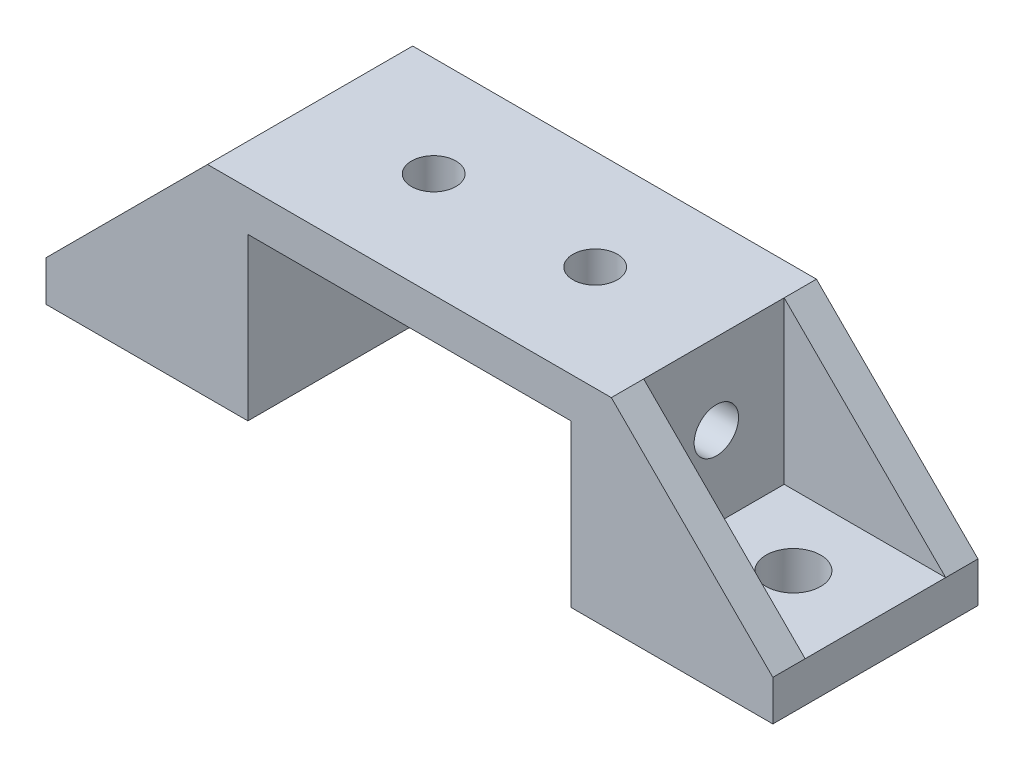
ISO-10303-21;
HEADER;
FILE_DESCRIPTION(('STEP AP214'),'2;1');
FILE_NAME('part.step','',(''),(''),'','','');
FILE_SCHEMA(('AUTOMOTIVE_DESIGN { 1 0 10303 214 1 1 1 1 }'));
ENDSEC;
DATA;
#1=APPLICATION_CONTEXT('core data for automotive mechanical design processes');
#2=APPLICATION_PROTOCOL_DEFINITION('international standard','automotive_design',2000,#1);
#3=PRODUCT_CONTEXT('',#1,'mechanical');
#4=PRODUCT('Part','Part','',(#3));
#5=PRODUCT_RELATED_PRODUCT_CATEGORY('part','',(#4));
#6=PRODUCT_DEFINITION_FORMATION('','',#4);
#7=PRODUCT_DEFINITION_CONTEXT('part definition',#1,'design');
#8=PRODUCT_DEFINITION('design','',#6,#7);
#9=PRODUCT_DEFINITION_SHAPE('','',#8);
#10=(LENGTH_UNIT() NAMED_UNIT(*) SI_UNIT(.MILLI.,.METRE.));
#11=(NAMED_UNIT(*) PLANE_ANGLE_UNIT() SI_UNIT($,.RADIAN.));
#12=(NAMED_UNIT(*) SI_UNIT($,.STERADIAN.) SOLID_ANGLE_UNIT());
#13=UNCERTAINTY_MEASURE_WITH_UNIT(LENGTH_MEASURE(1.E-05),#10,'distance_accuracy_value','');
#14=(GEOMETRIC_REPRESENTATION_CONTEXT(3) GLOBAL_UNCERTAINTY_ASSIGNED_CONTEXT((#13)) GLOBAL_UNIT_ASSIGNED_CONTEXT((#10,
#11,#12)) REPRESENTATION_CONTEXT('',''));
#15=CARTESIAN_POINT('',(0.,0.,0.));
#16=DIRECTION('',(0.,0.,1.));
#17=DIRECTION('',(1.,0.,0.));
#18=AXIS2_PLACEMENT_3D('',#15,#16,#17);
#19=CARTESIAN_POINT('',(0.,15.,25.4));
#20=DIRECTION('',(0.,1.,0.));
#21=DIRECTION('',(0.,0.,1.));
#22=AXIS2_PLACEMENT_3D('',#19,#20,#21);
#23=PLANE('',#22);
#24=CARTESIAN_POINT('',(10.,15.,12.4));
#25=DIRECTION('',(0.,1.,0.));
#26=DIRECTION('',(0.,0.,1.));
#27=AXIS2_PLACEMENT_3D('',#24,#25,#26);
#28=CIRCLE('',#27,2.74999999999999);
#29=CARTESIAN_POINT('',(10.,15.,15.15));
#30=VERTEX_POINT('',#29);
#31=EDGE_CURVE('E337',#30,#30,#28,.T.);
#32=ORIENTED_EDGE('',*,*,#31,.F.);
#33=EDGE_LOOP('',(#32));
#34=FACE_BOUND('',#33,.T.);
#35=CARTESIAN_POINT('',(-10.,15.,12.4));
#36=DIRECTION('',(0.,1.,0.));
#37=DIRECTION('',(0.,0.,1.));
#38=AXIS2_PLACEMENT_3D('',#35,#36,#37);
#39=CIRCLE('',#38,2.74999999999999);
#40=CARTESIAN_POINT('',(-10.,15.,15.15));
#41=VERTEX_POINT('',#40);
#42=EDGE_CURVE('E210',#41,#41,#39,.T.);
#43=ORIENTED_EDGE('',*,*,#42,.F.);
#44=EDGE_LOOP('',(#43));
#45=FACE_BOUND('',#44,.T.);
#46=DIRECTION('',(1.,0.,0.));
#47=VECTOR('',#46,1.);
#48=CARTESIAN_POINT('',(0.,15.,0.));
#49=LINE('',#48,#47);
#50=CARTESIAN_POINT('',(-25.,15.,0.));
#51=VERTEX_POINT('',#50);
#52=CARTESIAN_POINT('',(25.,15.,0.));
#53=VERTEX_POINT('',#52);
#54=EDGE_CURVE('E252',#51,#53,#49,.T.);
#55=ORIENTED_EDGE('',*,*,#54,.F.);
#56=DIRECTION('',(0.,0.,-1.));
#57=VECTOR('',#56,1.);
#58=CARTESIAN_POINT('',(-25.,15.,4.));
#59=LINE('',#58,#57);
#60=CARTESIAN_POINT('',(-25.,15.,4.));
#61=VERTEX_POINT('',#60);
#62=EDGE_CURVE('E242',#61,#51,#59,.T.);
#63=ORIENTED_EDGE('',*,*,#62,.F.);
#64=DIRECTION('',(0.,0.,-1.));
#65=VECTOR('',#64,1.);
#66=CARTESIAN_POINT('',(-25.,15.,25.4));
#67=LINE('',#66,#65);
#68=CARTESIAN_POINT('',(-25.,15.,21.4));
#69=VERTEX_POINT('',#68);
#70=EDGE_CURVE('E48',#69,#61,#67,.T.);
#71=ORIENTED_EDGE('',*,*,#70,.F.);
#72=CARTESIAN_POINT('',(-25.,15.,25.4));
#73=VERTEX_POINT('',#72);
#74=EDGE_CURVE('E11',#73,#69,#67,.T.);
#75=ORIENTED_EDGE('',*,*,#74,.F.);
#76=DIRECTION('',(1.,0.,0.));
#77=VECTOR('',#76,1.);
#78=CARTESIAN_POINT('',(0.,15.,25.4));
#79=LINE('',#78,#77);
#80=CARTESIAN_POINT('',(25.,15.,25.4));
#81=VERTEX_POINT('',#80);
#82=EDGE_CURVE('E253',#73,#81,#79,.T.);
#83=ORIENTED_EDGE('',*,*,#82,.T.);
#84=DIRECTION('',(0.,0.,-1.));
#85=VECTOR('',#84,1.);
#86=CARTESIAN_POINT('',(25.,15.,25.4));
#87=LINE('',#86,#85);
#88=CARTESIAN_POINT('',(25.,15.,21.4));
#89=VERTEX_POINT('',#88);
#90=EDGE_CURVE('E185',#81,#89,#87,.T.);
#91=ORIENTED_EDGE('',*,*,#90,.T.);
#92=CARTESIAN_POINT('',(25.,15.,4.));
#93=VERTEX_POINT('',#92);
#94=EDGE_CURVE('E383',#89,#93,#87,.T.);
#95=ORIENTED_EDGE('',*,*,#94,.T.);
#96=DIRECTION('',(0.,0.,-1.));
#97=VECTOR('',#96,1.);
#98=CARTESIAN_POINT('',(25.,15.,4.));
#99=LINE('',#98,#97);
#100=EDGE_CURVE('E345',#93,#53,#99,.T.);
#101=ORIENTED_EDGE('',*,*,#100,.T.);
#102=EDGE_LOOP('',(#55,#63,#71,#75,#83,#91,#95,#101));
#103=FACE_BOUND('',#102,.T.);
#104=ADVANCED_FACE('F39',(#34,#45,#103),#23,.T.);
#105=CARTESIAN_POINT('',(-25.,0.,25.4));
#106=DIRECTION('',(-1.,0.,0.));
#107=DIRECTION('',(0.,-1.,0.));
#108=AXIS2_PLACEMENT_3D('',#105,#106,#107);
#109=PLANE('',#108);
#110=CARTESIAN_POINT('',(-25.,5.,12.4));
#111=DIRECTION('',(-1.,0.,0.));
#112=DIRECTION('',(0.,0.,1.));
#113=AXIS2_PLACEMENT_3D('',#110,#111,#112);
#114=CIRCLE('',#113,2.74999999999999);
#115=CARTESIAN_POINT('',(-25.,5.,15.15));
#116=VERTEX_POINT('',#115);
#117=EDGE_CURVE('E202',#116,#116,#114,.T.);
#118=ORIENTED_EDGE('',*,*,#117,.F.);
#119=EDGE_LOOP('',(#118));
#120=FACE_BOUND('',#119,.T.);
#121=DIRECTION('',(0.,1.,0.));
#122=VECTOR('',#121,1.);
#123=CARTESIAN_POINT('',(-25.,0.,21.4));
#124=LINE('',#123,#122);
#125=CARTESIAN_POINT('',(-25.,-5.00000000000001,21.4));
#126=VERTEX_POINT('',#125);
#127=EDGE_CURVE('E219',#126,#69,#124,.T.);
#128=ORIENTED_EDGE('',*,*,#127,.T.);
#129=ORIENTED_EDGE('',*,*,#70,.T.);
#130=DIRECTION('',(0.,1.,0.));
#131=VECTOR('',#130,1.);
#132=CARTESIAN_POINT('',(-25.,0.,4.));
#133=LINE('',#132,#131);
#134=CARTESIAN_POINT('',(-25.,-5.00000000000001,4.));
#135=VERTEX_POINT('',#134);
#136=EDGE_CURVE('E238',#135,#61,#133,.T.);
#137=ORIENTED_EDGE('',*,*,#136,.F.);
#138=DIRECTION('',(0.,0.,-1.));
#139=VECTOR('',#138,1.);
#140=CARTESIAN_POINT('',(-25.,-5.00000000000001,25.4));
#141=LINE('',#140,#139);
#142=EDGE_CURVE('E301',#126,#135,#141,.T.);
#143=ORIENTED_EDGE('',*,*,#142,.F.);
#144=EDGE_LOOP('',(#128,#129,#137,#143));
#145=FACE_BOUND('',#144,.T.);
#146=ADVANCED_FACE('F327',(#120,#145),#109,.T.);
#147=CARTESIAN_POINT('',(0.,-5.00000000000001,25.4));
#148=DIRECTION('',(0.,1.,0.));
#149=DIRECTION('',(0.,0.,1.));
#150=AXIS2_PLACEMENT_3D('',#147,#148,#149);
#151=PLANE('',#150);
#152=CARTESIAN_POINT('',(-34.8400000000002,-5.00000000000001,12.7));
#153=DIRECTION('',(0.,1.,0.));
#154=DIRECTION('',(0.,0.,1.));
#155=AXIS2_PLACEMENT_3D('',#152,#153,#154);
#156=CIRCLE('',#155,3.3782);
#157=CARTESIAN_POINT('',(-34.8400000000002,-5.00000000000001,16.0782));
#158=VERTEX_POINT('',#157);
#159=EDGE_CURVE('E198',#158,#158,#156,.T.);
#160=ORIENTED_EDGE('',*,*,#159,.F.);
#161=EDGE_LOOP('',(#160));
#162=FACE_BOUND('',#161,.T.);
#163=DIRECTION('',(1.,0.,0.));
#164=VECTOR('',#163,1.);
#165=CARTESIAN_POINT('',(0.,-5.00000000000001,21.4));
#166=LINE('',#165,#164);
#167=CARTESIAN_POINT('',(-45.0000000000002,-5.,21.4));
#168=VERTEX_POINT('',#167);
#169=EDGE_CURVE('E223',#168,#126,#166,.T.);
#170=ORIENTED_EDGE('',*,*,#169,.T.);
#171=ORIENTED_EDGE('',*,*,#142,.T.);
#172=DIRECTION('',(1.,0.,0.));
#173=VECTOR('',#172,1.);
#174=CARTESIAN_POINT('',(0.,-5.00000000000001,4.));
#175=LINE('',#174,#173);
#176=CARTESIAN_POINT('',(-45.0000000000002,-5.,4.));
#177=VERTEX_POINT('',#176);
#178=EDGE_CURVE('E234',#177,#135,#175,.T.);
#179=ORIENTED_EDGE('',*,*,#178,.F.);
#180=DIRECTION('',(0.,0.,-1.));
#181=VECTOR('',#180,1.);
#182=CARTESIAN_POINT('',(-45.0000000000002,-5.,25.4));
#183=LINE('',#182,#181);
#184=EDGE_CURVE('E296',#168,#177,#183,.T.);
#185=ORIENTED_EDGE('',*,*,#184,.F.);
#186=EDGE_LOOP('',(#170,#171,#179,#185));
#187=FACE_BOUND('',#186,.T.);
#188=ADVANCED_FACE('F332',(#162,#187),#151,.T.);
#189=CARTESIAN_POINT('',(-45.0000000000002,0.,25.4));
#190=DIRECTION('',(1.,0.,0.));
#191=DIRECTION('',(0.,0.,-1.));
#192=AXIS2_PLACEMENT_3D('',#189,#190,#191);
#193=PLANE('',#192);
#194=DIRECTION('',(0.,-1.,0.));
#195=VECTOR('',#194,1.);
#196=CARTESIAN_POINT('',(-45.0000000000002,0.,0.));
#197=LINE('',#196,#195);
#198=CARTESIAN_POINT('',(-45.0000000000002,-5.,0.));
#199=VERTEX_POINT('',#198);
#200=CARTESIAN_POINT('',(-45.0000000000002,-10.,0.));
#201=VERTEX_POINT('',#200);
#202=EDGE_CURVE('E274',#199,#201,#197,.T.);
#203=ORIENTED_EDGE('',*,*,#202,.T.);
#204=DIRECTION('',(0.,0.,-1.));
#205=VECTOR('',#204,1.);
#206=CARTESIAN_POINT('',(-45.0000000000002,-10.,25.4));
#207=LINE('',#206,#205);
#208=CARTESIAN_POINT('',(-45.0000000000002,-10.,25.4));
#209=VERTEX_POINT('',#208);
#210=EDGE_CURVE('E293',#209,#201,#207,.T.);
#211=ORIENTED_EDGE('',*,*,#210,.F.);
#212=DIRECTION('',(0.,-1.,0.));
#213=VECTOR('',#212,1.);
#214=CARTESIAN_POINT('',(-45.0000000000002,0.,25.4));
#215=LINE('',#214,#213);
#216=CARTESIAN_POINT('',(-45.0000000000002,-5.,25.4));
#217=VERTEX_POINT('',#216);
#218=EDGE_CURVE('E257',#217,#209,#215,.T.);
#219=ORIENTED_EDGE('',*,*,#218,.F.);
#220=EDGE_CURVE('E297',#217,#168,#183,.T.);
#221=ORIENTED_EDGE('',*,*,#220,.T.);
#222=ORIENTED_EDGE('',*,*,#184,.T.);
#223=DIRECTION('',(0.,0.,-1.));
#224=VECTOR('',#223,1.);
#225=CARTESIAN_POINT('',(-45.0000000000002,-5.,4.));
#226=LINE('',#225,#224);
#227=EDGE_CURVE('E248',#177,#199,#226,.T.);
#228=ORIENTED_EDGE('',*,*,#227,.T.);
#229=EDGE_LOOP('',(#203,#211,#219,#221,#222,#228));
#230=FACE_BOUND('',#229,.T.);
#231=ADVANCED_FACE('F367',(#230),#193,.F.);
#232=CARTESIAN_POINT('',(0.,-9.99999999999999,25.4));
#233=DIRECTION('',(0.,-1.,0.));
#234=DIRECTION('',(1.,0.,0.));
#235=AXIS2_PLACEMENT_3D('',#232,#233,#234);
#236=PLANE('',#235);
#237=CARTESIAN_POINT('',(-34.8400000000002,-10.,12.7));
#238=DIRECTION('',(0.,-1.,0.));
#239=DIRECTION('',(1.,0.,0.));
#240=AXIS2_PLACEMENT_3D('',#237,#238,#239);
#241=CIRCLE('',#240,3.3782);
#242=CARTESIAN_POINT('',(-31.4618000000002,-10.,12.7));
#243=VERTEX_POINT('',#242);
#244=EDGE_CURVE('E42',#243,#243,#241,.T.);
#245=ORIENTED_EDGE('',*,*,#244,.F.);
#246=EDGE_LOOP('',(#245));
#247=FACE_BOUND('',#246,.T.);
#248=DIRECTION('',(-1.,0.,0.));
#249=VECTOR('',#248,1.);
#250=CARTESIAN_POINT('',(0.,-9.99999999999999,0.));
#251=LINE('',#250,#249);
#252=CARTESIAN_POINT('',(-20.,-10.,0.));
#253=VERTEX_POINT('',#252);
#254=EDGE_CURVE('E278',#253,#201,#251,.T.);
#255=ORIENTED_EDGE('',*,*,#254,.F.);
#256=DIRECTION('',(0.,0.,-1.));
#257=VECTOR('',#256,1.);
#258=CARTESIAN_POINT('',(-20.,-10.,25.4));
#259=LINE('',#258,#257);
#260=CARTESIAN_POINT('',(-20.,-10.,25.4));
#261=VERTEX_POINT('',#260);
#262=EDGE_CURVE('E290',#261,#253,#259,.T.);
#263=ORIENTED_EDGE('',*,*,#262,.F.);
#264=DIRECTION('',(-1.,0.,0.));
#265=VECTOR('',#264,1.);
#266=CARTESIAN_POINT('',(0.,-9.99999999999999,25.4));
#267=LINE('',#266,#265);
#268=EDGE_CURVE('E261',#261,#209,#267,.T.);
#269=ORIENTED_EDGE('',*,*,#268,.T.);
#270=ORIENTED_EDGE('',*,*,#210,.T.);
#271=EDGE_LOOP('',(#255,#263,#269,#270));
#272=FACE_BOUND('',#271,.T.);
#273=ADVANCED_FACE('F483',(#247,#272),#236,.T.);
#274=CARTESIAN_POINT('',(-20.,0.,25.4));
#275=DIRECTION('',(-1.,0.,0.));
#276=DIRECTION('',(0.,0.,1.));
#277=AXIS2_PLACEMENT_3D('',#274,#275,#276);
#278=PLANE('',#277);
#279=CARTESIAN_POINT('',(-20.,5.,12.4));
#280=DIRECTION('',(-1.,0.,0.));
#281=DIRECTION('',(0.,0.,1.));
#282=AXIS2_PLACEMENT_3D('',#279,#280,#281);
#283=CIRCLE('',#282,2.74999999999999);
#284=CARTESIAN_POINT('',(-20.,5.,15.15));
#285=VERTEX_POINT('',#284);
#286=EDGE_CURVE('E206',#285,#285,#283,.T.);
#287=ORIENTED_EDGE('',*,*,#286,.T.);
#288=EDGE_LOOP('',(#287));
#289=FACE_BOUND('',#288,.T.);
#290=DIRECTION('',(0.,1.,0.));
#291=VECTOR('',#290,1.);
#292=CARTESIAN_POINT('',(-20.,0.,0.));
#293=LINE('',#292,#291);
#294=CARTESIAN_POINT('',(-20.,10.,0.));
#295=VERTEX_POINT('',#294);
#296=EDGE_CURVE('E282',#253,#295,#293,.T.);
#297=ORIENTED_EDGE('',*,*,#296,.T.);
#298=DIRECTION('',(0.,0.,-1.));
#299=VECTOR('',#298,1.);
#300=CARTESIAN_POINT('',(-20.,10.,25.4));
#301=LINE('',#300,#299);
#302=CARTESIAN_POINT('',(-20.,10.,25.4));
#303=VERTEX_POINT('',#302);
#304=EDGE_CURVE('E271',#303,#295,#301,.T.);
#305=ORIENTED_EDGE('',*,*,#304,.F.);
#306=DIRECTION('',(0.,1.,0.));
#307=VECTOR('',#306,1.);
#308=CARTESIAN_POINT('',(-20.,0.,25.4));
#309=LINE('',#308,#307);
#310=EDGE_CURVE('E265',#261,#303,#309,.T.);
#311=ORIENTED_EDGE('',*,*,#310,.F.);
#312=ORIENTED_EDGE('',*,*,#262,.T.);
#313=EDGE_LOOP('',(#297,#305,#311,#312));
#314=FACE_BOUND('',#313,.T.);
#315=ADVANCED_FACE('F488',(#289,#314),#278,.F.);
#316=CARTESIAN_POINT('',(0.,10.,25.4));
#317=DIRECTION('',(0.,1.,0.));
#318=DIRECTION('',(0.,0.,1.));
#319=AXIS2_PLACEMENT_3D('',#316,#317,#318);
#320=PLANE('',#319);
#321=CARTESIAN_POINT('',(10.,10.,12.4));
#322=DIRECTION('',(0.,1.,0.));
#323=DIRECTION('',(0.,0.,1.));
#324=AXIS2_PLACEMENT_3D('',#321,#322,#323);
#325=CIRCLE('',#324,2.74999999999999);
#326=CARTESIAN_POINT('',(10.,10.,15.15));
#327=VERTEX_POINT('',#326);
#328=EDGE_CURVE('E380',#327,#327,#325,.T.);
#329=ORIENTED_EDGE('',*,*,#328,.T.);
#330=EDGE_LOOP('',(#329));
#331=FACE_BOUND('',#330,.T.);
#332=CARTESIAN_POINT('',(-10.,10.,12.4));
#333=DIRECTION('',(0.,1.,0.));
#334=DIRECTION('',(0.,0.,1.));
#335=AXIS2_PLACEMENT_3D('',#332,#333,#334);
#336=CIRCLE('',#335,2.74999999999999);
#337=CARTESIAN_POINT('',(-10.,10.,15.15));
#338=VERTEX_POINT('',#337);
#339=EDGE_CURVE('E214',#338,#338,#336,.T.);
#340=ORIENTED_EDGE('',*,*,#339,.T.);
#341=EDGE_LOOP('',(#340));
#342=FACE_BOUND('',#341,.T.);
#343=DIRECTION('',(1.,0.,0.));
#344=VECTOR('',#343,1.);
#345=CARTESIAN_POINT('',(0.,10.,0.));
#346=LINE('',#345,#344);
#347=CARTESIAN_POINT('',(20.,10.,0.));
#348=VERTEX_POINT('',#347);
#349=EDGE_CURVE('E258',#295,#348,#346,.T.);
#350=ORIENTED_EDGE('',*,*,#349,.T.);
#351=DIRECTION('',(0.,0.,-1.));
#352=VECTOR('',#351,1.);
#353=CARTESIAN_POINT('',(20.,10.,25.4));
#354=LINE('',#353,#352);
#355=CARTESIAN_POINT('',(20.,10.,25.4));
#356=VERTEX_POINT('',#355);
#357=EDGE_CURVE('E194',#356,#348,#354,.T.);
#358=ORIENTED_EDGE('',*,*,#357,.F.);
#359=DIRECTION('',(1.,0.,0.));
#360=VECTOR('',#359,1.);
#361=CARTESIAN_POINT('',(0.,10.,25.4));
#362=LINE('',#361,#360);
#363=EDGE_CURVE('E268',#303,#356,#362,.T.);
#364=ORIENTED_EDGE('',*,*,#363,.F.);
#365=ORIENTED_EDGE('',*,*,#304,.T.);
#366=EDGE_LOOP('',(#350,#358,#364,#365));
#367=FACE_BOUND('',#366,.T.);
#368=ADVANCED_FACE('F307',(#331,#342,#367),#320,.F.);
#369=CARTESIAN_POINT('',(0.,0.,25.4));
#370=DIRECTION('',(0.,0.,1.));
#371=DIRECTION('',(1.,0.,0.));
#372=AXIS2_PLACEMENT_3D('',#369,#370,#371);
#373=PLANE('',#372);
#374=ORIENTED_EDGE('',*,*,#82,.F.);
#375=DIRECTION('',(-0.707106781186551,-0.707106781186544,0.));
#376=VECTOR('',#375,1.);
#377=CARTESIAN_POINT('',(-19.9999999999999,20.0000000000001,25.4));
#378=LINE('',#377,#376);
#379=EDGE_CURVE('E220',#73,#217,#378,.T.);
#380=ORIENTED_EDGE('',*,*,#379,.T.);
#381=ORIENTED_EDGE('',*,*,#218,.T.);
#382=ORIENTED_EDGE('',*,*,#268,.F.);
#383=ORIENTED_EDGE('',*,*,#310,.T.);
#384=ORIENTED_EDGE('',*,*,#363,.T.);
#385=DIRECTION('',(0.,1.,0.));
#386=VECTOR('',#385,1.);
#387=CARTESIAN_POINT('',(20.,0.,25.4));
#388=LINE('',#387,#386);
#389=CARTESIAN_POINT('',(20.,-10.,25.4));
#390=VERTEX_POINT('',#389);
#391=EDGE_CURVE('E389',#390,#356,#388,.T.);
#392=ORIENTED_EDGE('',*,*,#391,.F.);
#393=DIRECTION('',(1.,0.,0.));
#394=VECTOR('',#393,1.);
#395=CARTESIAN_POINT('',(0.,-9.99999999999999,25.4));
#396=LINE('',#395,#394);
#397=CARTESIAN_POINT('',(45.0000000000002,-10.,25.4));
#398=VERTEX_POINT('',#397);
#399=EDGE_CURVE('E400',#390,#398,#396,.T.);
#400=ORIENTED_EDGE('',*,*,#399,.T.);
#401=DIRECTION('',(0.,-1.,0.));
#402=VECTOR('',#401,1.);
#403=CARTESIAN_POINT('',(45.0000000000002,0.,25.4));
#404=LINE('',#403,#402);
#405=CARTESIAN_POINT('',(45.0000000000002,-5.,25.4));
#406=VERTEX_POINT('',#405);
#407=EDGE_CURVE('E378',#406,#398,#404,.T.);
#408=ORIENTED_EDGE('',*,*,#407,.F.);
#409=DIRECTION('',(0.707106781186551,-0.707106781186544,0.));
#410=VECTOR('',#409,1.);
#411=CARTESIAN_POINT('',(19.9999999999999,20.0000000000001,25.4));
#412=LINE('',#411,#410);
#413=EDGE_CURVE('E165',#81,#406,#412,.T.);
#414=ORIENTED_EDGE('',*,*,#413,.F.);
#415=EDGE_LOOP('',(#374,#380,#381,#382,#383,#384,#392,#400,#408,#414));
#416=FACE_BOUND('',#415,.T.);
#417=ADVANCED_FACE('F377',(#416),#373,.T.);
#418=CARTESIAN_POINT('',(0.,0.,0.));
#419=DIRECTION('',(0.,0.,1.));
#420=DIRECTION('',(1.,0.,0.));
#421=AXIS2_PLACEMENT_3D('',#418,#419,#420);
#422=PLANE('',#421);
#423=ORIENTED_EDGE('',*,*,#54,.T.);
#424=DIRECTION('',(0.707106781186551,-0.707106781186544,0.));
#425=VECTOR('',#424,1.);
#426=CARTESIAN_POINT('',(19.9999999999999,20.0000000000001,0.));
#427=LINE('',#426,#425);
#428=CARTESIAN_POINT('',(45.0000000000002,-5.,0.));
#429=VERTEX_POINT('',#428);
#430=EDGE_CURVE('E351',#53,#429,#427,.T.);
#431=ORIENTED_EDGE('',*,*,#430,.T.);
#432=DIRECTION('',(0.,-1.,0.));
#433=VECTOR('',#432,1.);
#434=CARTESIAN_POINT('',(45.0000000000002,0.,0.));
#435=LINE('',#434,#433);
#436=CARTESIAN_POINT('',(45.0000000000002,-10.,0.));
#437=VERTEX_POINT('',#436);
#438=EDGE_CURVE('E386',#429,#437,#435,.T.);
#439=ORIENTED_EDGE('',*,*,#438,.T.);
#440=DIRECTION('',(1.,0.,0.));
#441=VECTOR('',#440,1.);
#442=CARTESIAN_POINT('',(0.,-9.99999999999999,0.));
#443=LINE('',#442,#441);
#444=CARTESIAN_POINT('',(20.,-10.,0.));
#445=VERTEX_POINT('',#444);
#446=EDGE_CURVE('E390',#445,#437,#443,.T.);
#447=ORIENTED_EDGE('',*,*,#446,.F.);
#448=DIRECTION('',(0.,1.,0.));
#449=VECTOR('',#448,1.);
#450=CARTESIAN_POINT('',(20.,0.,0.));
#451=LINE('',#450,#449);
#452=EDGE_CURVE('E394',#445,#348,#451,.T.);
#453=ORIENTED_EDGE('',*,*,#452,.T.);
#454=ORIENTED_EDGE('',*,*,#349,.F.);
#455=ORIENTED_EDGE('',*,*,#296,.F.);
#456=ORIENTED_EDGE('',*,*,#254,.T.);
#457=ORIENTED_EDGE('',*,*,#202,.F.);
#458=DIRECTION('',(-0.707106781186551,-0.707106781186544,0.));
#459=VECTOR('',#458,1.);
#460=CARTESIAN_POINT('',(-19.9999999999999,20.0000000000001,0.));
#461=LINE('',#460,#459);
#462=EDGE_CURVE('E226',#51,#199,#461,.T.);
#463=ORIENTED_EDGE('',*,*,#462,.F.);
#464=EDGE_LOOP('',(#423,#431,#439,#447,#453,#454,#455,#456,#457,#463));
#465=FACE_BOUND('',#464,.T.);
#466=ADVANCED_FACE('F349',(#465),#422,.F.);
#467=CARTESIAN_POINT('',(-19.9999999999999,20.0000000000001,4.));
#468=DIRECTION('',(0.707106781186544,-0.707106781186551,0.));
#469=DIRECTION('',(0.707106781186551,0.707106781186544,0.));
#470=AXIS2_PLACEMENT_3D('',#467,#468,#469);
#471=PLANE('',#470);
#472=ORIENTED_EDGE('',*,*,#462,.T.);
#473=ORIENTED_EDGE('',*,*,#227,.F.);
#474=DIRECTION('',(-0.707106781186551,-0.707106781186544,0.));
#475=VECTOR('',#474,1.);
#476=CARTESIAN_POINT('',(-19.9999999999999,20.0000000000001,4.));
#477=LINE('',#476,#475);
#478=EDGE_CURVE('E230',#61,#177,#477,.T.);
#479=ORIENTED_EDGE('',*,*,#478,.F.);
#480=ORIENTED_EDGE('',*,*,#62,.T.);
#481=EDGE_LOOP('',(#472,#473,#479,#480));
#482=FACE_BOUND('',#481,.T.);
#483=ADVANCED_FACE('F356',(#482),#471,.F.);
#484=CARTESIAN_POINT('',(0.,0.,4.));
#485=DIRECTION('',(0.,0.,1.));
#486=DIRECTION('',(1.,0.,0.));
#487=AXIS2_PLACEMENT_3D('',#484,#485,#486);
#488=PLANE('',#487);
#489=ORIENTED_EDGE('',*,*,#478,.T.);
#490=ORIENTED_EDGE('',*,*,#178,.T.);
#491=ORIENTED_EDGE('',*,*,#136,.T.);
#492=EDGE_LOOP('',(#489,#490,#491));
#493=FACE_BOUND('',#492,.T.);
#494=ADVANCED_FACE('F359',(#493),#488,.T.);
#495=CARTESIAN_POINT('',(-19.9999999999999,20.0000000000001,21.4));
#496=DIRECTION('',(-0.707106781186544,0.707106781186551,0.));
#497=DIRECTION('',(-0.707106781186551,-0.707106781186544,0.));
#498=AXIS2_PLACEMENT_3D('',#495,#496,#497);
#499=PLANE('',#498);
#500=ORIENTED_EDGE('',*,*,#379,.F.);
#501=ORIENTED_EDGE('',*,*,#74,.T.);
#502=DIRECTION('',(-0.707106781186551,-0.707106781186544,0.));
#503=VECTOR('',#502,1.);
#504=CARTESIAN_POINT('',(-19.9999999999999,20.0000000000001,21.4));
#505=LINE('',#504,#503);
#506=EDGE_CURVE('E215',#69,#168,#505,.T.);
#507=ORIENTED_EDGE('',*,*,#506,.T.);
#508=ORIENTED_EDGE('',*,*,#220,.F.);
#509=EDGE_LOOP('',(#500,#501,#507,#508));
#510=FACE_BOUND('',#509,.T.);
#511=ADVANCED_FACE('F323',(#510),#499,.T.);
#512=CARTESIAN_POINT('',(0.,0.,21.4));
#513=DIRECTION('',(0.,0.,-1.));
#514=DIRECTION('',(1.,0.,0.));
#515=AXIS2_PLACEMENT_3D('',#512,#513,#514);
#516=PLANE('',#515);
#517=ORIENTED_EDGE('',*,*,#506,.F.);
#518=ORIENTED_EDGE('',*,*,#127,.F.);
#519=ORIENTED_EDGE('',*,*,#169,.F.);
#520=EDGE_LOOP('',(#517,#518,#519));
#521=FACE_BOUND('',#520,.T.);
#522=ADVANCED_FACE('F313',(#521),#516,.T.);
#523=CARTESIAN_POINT('',(-10.,15.,12.4));
#524=DIRECTION('',(0.,1.,0.));
#525=DIRECTION('',(0.,0.,1.));
#526=AXIS2_PLACEMENT_3D('',#523,#524,#525);
#527=CYLINDRICAL_SURFACE('',#526,2.74999999999999);
#528=ORIENTED_EDGE('',*,*,#42,.T.);
#529=EDGE_LOOP('',(#528));
#530=FACE_BOUND('',#529,.T.);
#531=ORIENTED_EDGE('',*,*,#339,.F.);
#532=EDGE_LOOP('',(#531));
#533=FACE_BOUND('',#532,.T.);
#534=ADVANCED_FACE('F310',(#530,#533),#527,.F.);
#535=CARTESIAN_POINT('',(-25.,5.,12.4));
#536=DIRECTION('',(-1.,0.,0.));
#537=DIRECTION('',(0.,0.,1.));
#538=AXIS2_PLACEMENT_3D('',#535,#536,#537);
#539=CYLINDRICAL_SURFACE('',#538,2.74999999999999);
#540=ORIENTED_EDGE('',*,*,#117,.T.);
#541=EDGE_LOOP('',(#540));
#542=FACE_BOUND('',#541,.T.);
#543=ORIENTED_EDGE('',*,*,#286,.F.);
#544=EDGE_LOOP('',(#543));
#545=FACE_BOUND('',#544,.T.);
#546=ADVANCED_FACE('F312',(#542,#545),#539,.F.);
#547=CARTESIAN_POINT('',(-34.8400000000002,-5.00000000000001,12.7));
#548=DIRECTION('',(0.,1.,0.));
#549=DIRECTION('',(0.,0.,1.));
#550=AXIS2_PLACEMENT_3D('',#547,#548,#549);
#551=CYLINDRICAL_SURFACE('',#550,3.3782);
#552=ORIENTED_EDGE('',*,*,#244,.T.);
#553=EDGE_LOOP('',(#552));
#554=FACE_BOUND('',#553,.T.);
#555=ORIENTED_EDGE('',*,*,#159,.T.);
#556=EDGE_LOOP('',(#555));
#557=FACE_BOUND('',#556,.T.);
#558=ADVANCED_FACE('F320',(#554,#557),#551,.F.);
#559=CARTESIAN_POINT('',(20.,0.,25.4));
#560=DIRECTION('',(-1.,0.,0.));
#561=DIRECTION('',(0.,0.,1.));
#562=AXIS2_PLACEMENT_3D('',#559,#560,#561);
#563=PLANE('',#562);
#564=CARTESIAN_POINT('',(20.,5.,12.4));
#565=DIRECTION('',(-1.,0.,0.));
#566=DIRECTION('',(0.,0.,1.));
#567=AXIS2_PLACEMENT_3D('',#564,#565,#566);
#568=CIRCLE('',#567,2.74999999999999);
#569=CARTESIAN_POINT('',(20.,5.,15.15));
#570=VERTEX_POINT('',#569);
#571=EDGE_CURVE('E428',#570,#570,#568,.T.);
#572=ORIENTED_EDGE('',*,*,#571,.F.);
#573=EDGE_LOOP('',(#572));
#574=FACE_BOUND('',#573,.T.);
#575=ORIENTED_EDGE('',*,*,#452,.F.);
#576=DIRECTION('',(0.,0.,-1.));
#577=VECTOR('',#576,1.);
#578=CARTESIAN_POINT('',(20.,-10.,25.4));
#579=LINE('',#578,#577);
#580=EDGE_CURVE('E191',#390,#445,#579,.T.);
#581=ORIENTED_EDGE('',*,*,#580,.F.);
#582=ORIENTED_EDGE('',*,*,#391,.T.);
#583=ORIENTED_EDGE('',*,*,#357,.T.);
#584=EDGE_LOOP('',(#575,#581,#582,#583));
#585=FACE_BOUND('',#584,.T.);
#586=ADVANCED_FACE('F464',(#574,#585),#563,.T.);
#587=CARTESIAN_POINT('',(0.,-9.99999999999999,25.4));
#588=DIRECTION('',(0.,1.,0.));
#589=DIRECTION('',(-1.,0.,0.));
#590=AXIS2_PLACEMENT_3D('',#587,#588,#589);
#591=PLANE('',#590);
#592=CARTESIAN_POINT('',(34.8400000000002,-10.,12.7));
#593=DIRECTION('',(0.,1.,0.));
#594=DIRECTION('',(-1.,0.,0.));
#595=AXIS2_PLACEMENT_3D('',#592,#593,#594);
#596=CIRCLE('',#595,3.3782);
#597=CARTESIAN_POINT('',(31.4618000000002,-10.,12.7));
#598=VERTEX_POINT('',#597);
#599=EDGE_CURVE('E436',#598,#598,#596,.T.);
#600=ORIENTED_EDGE('',*,*,#599,.T.);
#601=EDGE_LOOP('',(#600));
#602=FACE_BOUND('',#601,.T.);
#603=ORIENTED_EDGE('',*,*,#446,.T.);
#604=DIRECTION('',(0.,0.,-1.));
#605=VECTOR('',#604,1.);
#606=CARTESIAN_POINT('',(45.0000000000002,-10.,25.4));
#607=LINE('',#606,#605);
#608=EDGE_CURVE('E174',#398,#437,#607,.T.);
#609=ORIENTED_EDGE('',*,*,#608,.F.);
#610=ORIENTED_EDGE('',*,*,#399,.F.);
#611=ORIENTED_EDGE('',*,*,#580,.T.);
#612=EDGE_LOOP('',(#603,#609,#610,#611));
#613=FACE_BOUND('',#612,.T.);
#614=ADVANCED_FACE('F458',(#602,#613),#591,.F.);
#615=CARTESIAN_POINT('',(45.0000000000002,0.,25.4));
#616=DIRECTION('',(1.,0.,0.));
#617=DIRECTION('',(0.,0.,-1.));
#618=AXIS2_PLACEMENT_3D('',#615,#616,#617);
#619=PLANE('',#618);
#620=ORIENTED_EDGE('',*,*,#438,.F.);
#621=DIRECTION('',(0.,0.,-1.));
#622=VECTOR('',#621,1.);
#623=CARTESIAN_POINT('',(45.0000000000002,-5.,4.));
#624=LINE('',#623,#622);
#625=CARTESIAN_POINT('',(45.0000000000002,-5.,4.));
#626=VERTEX_POINT('',#625);
#627=EDGE_CURVE('E181',#626,#429,#624,.T.);
#628=ORIENTED_EDGE('',*,*,#627,.F.);
#629=DIRECTION('',(0.,0.,-1.));
#630=VECTOR('',#629,1.);
#631=CARTESIAN_POINT('',(45.0000000000002,-5.,25.4));
#632=LINE('',#631,#630);
#633=CARTESIAN_POINT('',(45.0000000000002,-5.,21.4));
#634=VERTEX_POINT('',#633);
#635=EDGE_CURVE('E56',#634,#626,#632,.T.);
#636=ORIENTED_EDGE('',*,*,#635,.F.);
#637=EDGE_CURVE('E168',#406,#634,#632,.T.);
#638=ORIENTED_EDGE('',*,*,#637,.F.);
#639=ORIENTED_EDGE('',*,*,#407,.T.);
#640=ORIENTED_EDGE('',*,*,#608,.T.);
#641=EDGE_LOOP('',(#620,#628,#636,#638,#639,#640));
#642=FACE_BOUND('',#641,.T.);
#643=ADVANCED_FACE('F179',(#642),#619,.T.);
#644=CARTESIAN_POINT('',(0.,-5.00000000000001,25.4));
#645=DIRECTION('',(0.,-1.,0.));
#646=DIRECTION('',(0.,0.,-1.));
#647=AXIS2_PLACEMENT_3D('',#644,#645,#646);
#648=PLANE('',#647);
#649=CARTESIAN_POINT('',(34.8400000000002,-5.00000000000001,12.7));
#650=DIRECTION('',(0.,1.,0.));
#651=DIRECTION('',(0.,0.,1.));
#652=AXIS2_PLACEMENT_3D('',#649,#650,#651);
#653=CIRCLE('',#652,3.3782);
#654=CARTESIAN_POINT('',(34.8400000000002,-5.00000000000001,16.0782));
#655=VERTEX_POINT('',#654);
#656=EDGE_CURVE('E440',#655,#655,#653,.T.);
#657=ORIENTED_EDGE('',*,*,#656,.F.);
#658=EDGE_LOOP('',(#657));
#659=FACE_BOUND('',#658,.T.);
#660=DIRECTION('',(0.,0.,-1.));
#661=VECTOR('',#660,1.);
#662=CARTESIAN_POINT('',(25.,-5.00000000000001,25.4));
#663=LINE('',#662,#661);
#664=CARTESIAN_POINT('',(25.,-5.00000000000001,21.4));
#665=VERTEX_POINT('',#664);
#666=CARTESIAN_POINT('',(25.,-5.00000000000001,4.));
#667=VERTEX_POINT('',#666);
#668=EDGE_CURVE('E64',#665,#667,#663,.T.);
#669=ORIENTED_EDGE('',*,*,#668,.F.);
#670=DIRECTION('',(-1.,0.,0.));
#671=VECTOR('',#670,1.);
#672=CARTESIAN_POINT('',(0.,-5.00000000000001,21.4));
#673=LINE('',#672,#671);
#674=EDGE_CURVE('E159',#634,#665,#673,.T.);
#675=ORIENTED_EDGE('',*,*,#674,.F.);
#676=ORIENTED_EDGE('',*,*,#635,.T.);
#677=DIRECTION('',(-1.,0.,0.));
#678=VECTOR('',#677,1.);
#679=CARTESIAN_POINT('',(0.,-5.00000000000001,4.));
#680=LINE('',#679,#678);
#681=EDGE_CURVE('E410',#626,#667,#680,.T.);
#682=ORIENTED_EDGE('',*,*,#681,.T.);
#683=EDGE_LOOP('',(#669,#675,#676,#682));
#684=FACE_BOUND('',#683,.T.);
#685=ADVANCED_FACE('F176',(#659,#684),#648,.F.);
#686=CARTESIAN_POINT('',(25.,0.,25.4));
#687=DIRECTION('',(-1.,0.,0.));
#688=DIRECTION('',(0.,-1.,0.));
#689=AXIS2_PLACEMENT_3D('',#686,#687,#688);
#690=PLANE('',#689);
#691=CARTESIAN_POINT('',(25.,5.,12.4));
#692=DIRECTION('',(1.,0.,0.));
#693=DIRECTION('',(0.,0.,-1.));
#694=AXIS2_PLACEMENT_3D('',#691,#692,#693);
#695=CIRCLE('',#694,2.74999999999999);
#696=CARTESIAN_POINT('',(25.,5.,9.65000000000001));
#697=VERTEX_POINT('',#696);
#698=EDGE_CURVE('E432',#697,#697,#695,.T.);
#699=ORIENTED_EDGE('',*,*,#698,.F.);
#700=EDGE_LOOP('',(#699));
#701=FACE_BOUND('',#700,.T.);
#702=ORIENTED_EDGE('',*,*,#94,.F.);
#703=DIRECTION('',(0.,1.,0.));
#704=VECTOR('',#703,1.);
#705=CARTESIAN_POINT('',(25.,0.,21.4));
#706=LINE('',#705,#704);
#707=EDGE_CURVE('E160',#665,#89,#706,.T.);
#708=ORIENTED_EDGE('',*,*,#707,.F.);
#709=ORIENTED_EDGE('',*,*,#668,.T.);
#710=DIRECTION('',(0.,1.,0.));
#711=VECTOR('',#710,1.);
#712=CARTESIAN_POINT('',(25.,0.,4.));
#713=LINE('',#712,#711);
#714=EDGE_CURVE('E416',#667,#93,#713,.T.);
#715=ORIENTED_EDGE('',*,*,#714,.T.);
#716=EDGE_LOOP('',(#702,#708,#709,#715));
#717=FACE_BOUND('',#716,.T.);
#718=ADVANCED_FACE('F449',(#701,#717),#690,.F.);
#719=CARTESIAN_POINT('',(19.9999999999999,20.0000000000001,4.));
#720=DIRECTION('',(0.707106781186544,0.707106781186551,0.));
#721=DIRECTION('',(-0.707106781186551,0.707106781186544,0.));
#722=AXIS2_PLACEMENT_3D('',#719,#720,#721);
#723=PLANE('',#722);
#724=ORIENTED_EDGE('',*,*,#430,.F.);
#725=ORIENTED_EDGE('',*,*,#100,.F.);
#726=DIRECTION('',(0.707106781186551,-0.707106781186544,0.));
#727=VECTOR('',#726,1.);
#728=CARTESIAN_POINT('',(19.9999999999999,20.0000000000001,4.));
#729=LINE('',#728,#727);
#730=EDGE_CURVE('E413',#93,#626,#729,.T.);
#731=ORIENTED_EDGE('',*,*,#730,.T.);
#732=ORIENTED_EDGE('',*,*,#627,.T.);
#733=EDGE_LOOP('',(#724,#725,#731,#732));
#734=FACE_BOUND('',#733,.T.);
#735=ADVANCED_FACE('F455',(#734),#723,.T.);
#736=CARTESIAN_POINT('',(0.,0.,4.));
#737=DIRECTION('',(0.,0.,1.));
#738=DIRECTION('',(-1.,0.,0.));
#739=AXIS2_PLACEMENT_3D('',#736,#737,#738);
#740=PLANE('',#739);
#741=ORIENTED_EDGE('',*,*,#730,.F.);
#742=ORIENTED_EDGE('',*,*,#714,.F.);
#743=ORIENTED_EDGE('',*,*,#681,.F.);
#744=EDGE_LOOP('',(#741,#742,#743));
#745=FACE_BOUND('',#744,.T.);
#746=ADVANCED_FACE('F625',(#745),#740,.T.);
#747=CARTESIAN_POINT('',(19.9999999999999,20.0000000000001,21.4));
#748=DIRECTION('',(-0.707106781186544,-0.707106781186551,0.));
#749=DIRECTION('',(0.707106781186551,-0.707106781186544,0.));
#750=AXIS2_PLACEMENT_3D('',#747,#748,#749);
#751=PLANE('',#750);
#752=ORIENTED_EDGE('',*,*,#413,.T.);
#753=ORIENTED_EDGE('',*,*,#637,.T.);
#754=DIRECTION('',(0.707106781186551,-0.707106781186544,0.));
#755=VECTOR('',#754,1.);
#756=CARTESIAN_POINT('',(19.9999999999999,20.0000000000001,21.4));
#757=LINE('',#756,#755);
#758=EDGE_CURVE('E156',#89,#634,#757,.T.);
#759=ORIENTED_EDGE('',*,*,#758,.F.);
#760=ORIENTED_EDGE('',*,*,#90,.F.);
#761=EDGE_LOOP('',(#752,#753,#759,#760));
#762=FACE_BOUND('',#761,.T.);
#763=ADVANCED_FACE('F169',(#762),#751,.F.);
#764=CARTESIAN_POINT('',(0.,0.,21.4));
#765=DIRECTION('',(0.,0.,-1.));
#766=DIRECTION('',(-1.,0.,0.));
#767=AXIS2_PLACEMENT_3D('',#764,#765,#766);
#768=PLANE('',#767);
#769=ORIENTED_EDGE('',*,*,#758,.T.);
#770=ORIENTED_EDGE('',*,*,#674,.T.);
#771=ORIENTED_EDGE('',*,*,#707,.T.);
#772=EDGE_LOOP('',(#769,#770,#771));
#773=FACE_BOUND('',#772,.T.);
#774=ADVANCED_FACE('F158',(#773),#768,.T.);
#775=CARTESIAN_POINT('',(10.,15.,12.4));
#776=DIRECTION('',(0.,1.,0.));
#777=DIRECTION('',(0.,0.,1.));
#778=AXIS2_PLACEMENT_3D('',#775,#776,#777);
#779=CYLINDRICAL_SURFACE('',#778,2.74999999999999);
#780=ORIENTED_EDGE('',*,*,#31,.T.);
#781=EDGE_LOOP('',(#780));
#782=FACE_BOUND('',#781,.T.);
#783=ORIENTED_EDGE('',*,*,#328,.F.);
#784=EDGE_LOOP('',(#783));
#785=FACE_BOUND('',#784,.T.);
#786=ADVANCED_FACE('F649',(#782,#785),#779,.F.);
#787=CARTESIAN_POINT('',(25.,5.,12.4));
#788=DIRECTION('',(1.,0.,0.));
#789=DIRECTION('',(0.,0.,-1.));
#790=AXIS2_PLACEMENT_3D('',#787,#788,#789);
#791=CYLINDRICAL_SURFACE('',#790,2.74999999999999);
#792=ORIENTED_EDGE('',*,*,#571,.T.);
#793=EDGE_LOOP('',(#792));
#794=FACE_BOUND('',#793,.T.);
#795=ORIENTED_EDGE('',*,*,#698,.T.);
#796=EDGE_LOOP('',(#795));
#797=FACE_BOUND('',#796,.T.);
#798=ADVANCED_FACE('F658',(#794,#797),#791,.F.);
#799=CARTESIAN_POINT('',(34.8400000000002,-5.00000000000001,12.7));
#800=DIRECTION('',(0.,1.,0.));
#801=DIRECTION('',(0.,0.,1.));
#802=AXIS2_PLACEMENT_3D('',#799,#800,#801);
#803=CYLINDRICAL_SURFACE('',#802,3.3782);
#804=ORIENTED_EDGE('',*,*,#656,.T.);
#805=EDGE_LOOP('',(#804));
#806=FACE_BOUND('',#805,.T.);
#807=ORIENTED_EDGE('',*,*,#599,.F.);
#808=EDGE_LOOP('',(#807));
#809=FACE_BOUND('',#808,.T.);
#810=ADVANCED_FACE('F445',(#806,#809),#803,.F.);
#811=CLOSED_SHELL('',(#104,#146,#188,#231,#273,#315,#368,#417,#466,#483,#494,#511,#522,#534,
#546,#558,#586,#614,#643,#685,#718,#735,#746,#763,#774,#786,#798,#810));
#812=MANIFOLD_SOLID_BREP('B2',#811);
#813=ADVANCED_BREP_SHAPE_REPRESENTATION('',(#18,#812),#14);
#814=SHAPE_DEFINITION_REPRESENTATION(#9,#813);
ENDSEC;
END-ISO-10303-21;
